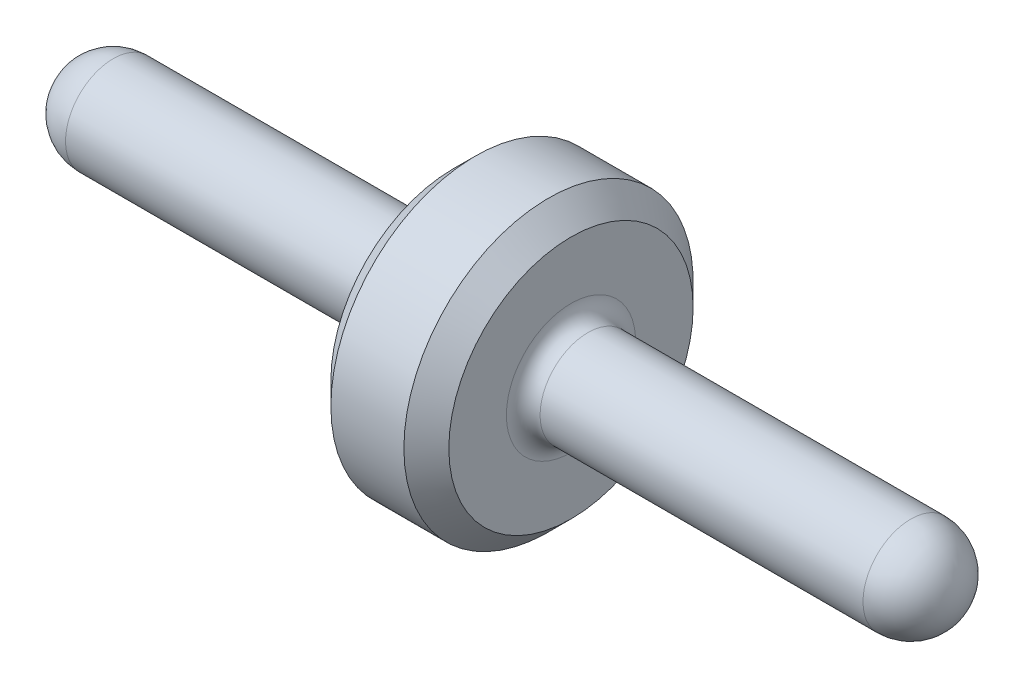
ISO-10303-21;
HEADER;
FILE_DESCRIPTION(('STEP AP214'),'2;1');
FILE_NAME('part.step','',(''),(''),'','','');
FILE_SCHEMA(('AUTOMOTIVE_DESIGN { 1 0 10303 214 1 1 1 1 }'));
ENDSEC;
DATA;
#1=APPLICATION_CONTEXT('core data for automotive mechanical design processes');
#2=APPLICATION_PROTOCOL_DEFINITION('international standard','automotive_design',2000,#1);
#3=PRODUCT_CONTEXT('',#1,'mechanical');
#4=PRODUCT('Part','Part','',(#3));
#5=PRODUCT_RELATED_PRODUCT_CATEGORY('part','',(#4));
#6=PRODUCT_DEFINITION_FORMATION('','',#4);
#7=PRODUCT_DEFINITION_CONTEXT('part definition',#1,'design');
#8=PRODUCT_DEFINITION('design','',#6,#7);
#9=PRODUCT_DEFINITION_SHAPE('','',#8);
#10=(LENGTH_UNIT() NAMED_UNIT(*) SI_UNIT(.MILLI.,.METRE.));
#11=(NAMED_UNIT(*) PLANE_ANGLE_UNIT() SI_UNIT($,.RADIAN.));
#12=(NAMED_UNIT(*) SI_UNIT($,.STERADIAN.) SOLID_ANGLE_UNIT());
#13=UNCERTAINTY_MEASURE_WITH_UNIT(LENGTH_MEASURE(1.E-05),#10,'distance_accuracy_value','');
#14=(GEOMETRIC_REPRESENTATION_CONTEXT(3) GLOBAL_UNCERTAINTY_ASSIGNED_CONTEXT((#13)) GLOBAL_UNIT_ASSIGNED_CONTEXT((#10,
#11,#12)) REPRESENTATION_CONTEXT('',''));
#15=CARTESIAN_POINT('',(0.,0.,0.));
#16=DIRECTION('',(0.,0.,1.));
#17=DIRECTION('',(1.,0.,0.));
#18=AXIS2_PLACEMENT_3D('',#15,#16,#17);
#19=CARTESIAN_POINT('',(1.67640000000001,0.,0.));
#20=DIRECTION('',(-1.,0.,0.));
#21=DIRECTION('',(0.,0.,1.));
#22=AXIS2_PLACEMENT_3D('',#19,#20,#21);
#23=TOROIDAL_SURFACE('',#22,0.29209999999999,0.0761999999999985);
#24=CARTESIAN_POINT('',(1.67640000000001,0.,0.));
#25=DIRECTION('',(-1.,0.,0.));
#26=DIRECTION('',(0.,0.,1.));
#27=AXIS2_PLACEMENT_3D('',#24,#25,#26);
#28=CIRCLE('',#27,0.215899999999991);
#29=CARTESIAN_POINT('',(1.67640000000001,0.,0.215899999999991));
#30=VERTEX_POINT('',#29);
#31=EDGE_CURVE('E10',#30,#30,#28,.T.);
#32=ORIENTED_EDGE('',*,*,#31,.F.);
#33=EDGE_LOOP('',(#32));
#34=FACE_BOUND('',#33,.T.);
#35=CARTESIAN_POINT('',(1.75260000000001,0.,0.));
#36=DIRECTION('',(-1.,0.,0.));
#37=DIRECTION('',(0.,0.,1.));
#38=AXIS2_PLACEMENT_3D('',#35,#36,#37);
#39=CIRCLE('',#38,0.29209999999999);
#40=CARTESIAN_POINT('',(1.75260000000001,0.,0.29209999999999));
#41=VERTEX_POINT('',#40);
#42=EDGE_CURVE('E65',#41,#41,#39,.T.);
#43=ORIENTED_EDGE('',*,*,#42,.T.);
#44=EDGE_LOOP('',(#43));
#45=FACE_BOUND('',#44,.T.);
#46=ADVANCED_FACE('F31',(#34,#45),#23,.F.);
#47=CARTESIAN_POINT('',(0.,0.,0.));
#48=DIRECTION('',(-1.,0.,0.));
#49=DIRECTION('',(0.,0.,1.));
#50=AXIS2_PLACEMENT_3D('',#47,#48,#49);
#51=CYLINDRICAL_SURFACE('',#50,0.215899999999991);
#52=CARTESIAN_POINT('',(0.215900000000005,0.,0.));
#53=DIRECTION('',(-1.,0.,0.));
#54=DIRECTION('',(0.,0.,1.));
#55=AXIS2_PLACEMENT_3D('',#52,#53,#54);
#56=CIRCLE('',#55,0.215899999999991);
#57=CARTESIAN_POINT('',(0.215900000000005,0.,0.215899999999991));
#58=VERTEX_POINT('',#57);
#59=EDGE_CURVE('E37',#58,#58,#56,.T.);
#60=ORIENTED_EDGE('',*,*,#59,.F.);
#61=EDGE_LOOP('',(#60));
#62=FACE_BOUND('',#61,.T.);
#63=ORIENTED_EDGE('',*,*,#31,.T.);
#64=EDGE_LOOP('',(#63));
#65=FACE_BOUND('',#64,.T.);
#66=ADVANCED_FACE('F119',(#62,#65),#51,.T.);
#67=CARTESIAN_POINT('',(0.215900000000005,0.,0.));
#68=DIRECTION('',(-1.,0.,0.));
#69=DIRECTION('',(0.,1.,0.));
#70=AXIS2_PLACEMENT_3D('',#67,#68,#69);
#71=SPHERICAL_SURFACE('',#70,0.215899999999998);
#72=ORIENTED_EDGE('',*,*,#59,.T.);
#73=EDGE_LOOP('',(#72));
#74=FACE_BOUND('',#73,.T.);
#75=ADVANCED_FACE('F114',(#74),#71,.T.);
#76=CARTESIAN_POINT('',(3.82270000000004,0.,0.));
#77=DIRECTION('',(-1.,0.,0.));
#78=DIRECTION('',(0.,1.,0.));
#79=AXIS2_PLACEMENT_3D('',#76,#77,#78);
#80=SPHERICAL_SURFACE('',#79,0.215899999999991);
#81=CARTESIAN_POINT('',(3.82270000000004,0.,0.));
#82=DIRECTION('',(-1.,0.,0.));
#83=DIRECTION('',(0.,0.,1.));
#84=AXIS2_PLACEMENT_3D('',#81,#82,#83);
#85=CIRCLE('',#84,0.215899999999991);
#86=CARTESIAN_POINT('',(3.82270000000004,0.,0.215899999999991));
#87=VERTEX_POINT('',#86);
#88=EDGE_CURVE('E41',#87,#87,#85,.T.);
#89=ORIENTED_EDGE('',*,*,#88,.F.);
#90=EDGE_LOOP('',(#89));
#91=FACE_BOUND('',#90,.T.);
#92=ADVANCED_FACE('F109',(#91),#80,.T.);
#93=CARTESIAN_POINT('',(0.,0.,0.));
#94=DIRECTION('',(-1.,0.,0.));
#95=DIRECTION('',(0.,0.,1.));
#96=AXIS2_PLACEMENT_3D('',#93,#94,#95);
#97=CYLINDRICAL_SURFACE('',#96,0.215899999999991);
#98=CARTESIAN_POINT('',(2.36220000000004,0.,0.));
#99=DIRECTION('',(-1.,0.,0.));
#100=DIRECTION('',(0.,0.,1.));
#101=AXIS2_PLACEMENT_3D('',#98,#99,#100);
#102=CIRCLE('',#101,0.215899999999991);
#103=CARTESIAN_POINT('',(2.36220000000004,0.,0.215899999999991));
#104=VERTEX_POINT('',#103);
#105=EDGE_CURVE('E45',#104,#104,#102,.T.);
#106=ORIENTED_EDGE('',*,*,#105,.F.);
#107=EDGE_LOOP('',(#106));
#108=FACE_BOUND('',#107,.T.);
#109=ORIENTED_EDGE('',*,*,#88,.T.);
#110=EDGE_LOOP('',(#109));
#111=FACE_BOUND('',#110,.T.);
#112=ADVANCED_FACE('F103',(#108,#111),#97,.T.);
#113=CARTESIAN_POINT('',(2.36220000000004,0.,0.));
#114=DIRECTION('',(-1.,0.,0.));
#115=DIRECTION('',(0.,0.,1.));
#116=AXIS2_PLACEMENT_3D('',#113,#114,#115);
#117=TOROIDAL_SURFACE('',#116,0.29209999999999,0.0761999999999985);
#118=CARTESIAN_POINT('',(2.28600000000004,0.,0.));
#119=DIRECTION('',(-1.,0.,0.));
#120=DIRECTION('',(0.,0.,1.));
#121=AXIS2_PLACEMENT_3D('',#118,#119,#120);
#122=CIRCLE('',#121,0.29209999999999);
#123=CARTESIAN_POINT('',(2.28600000000004,0.,0.29209999999999));
#124=VERTEX_POINT('',#123);
#125=EDGE_CURVE('E50',#124,#124,#122,.T.);
#126=ORIENTED_EDGE('',*,*,#125,.F.);
#127=EDGE_LOOP('',(#126));
#128=FACE_BOUND('',#127,.T.);
#129=ORIENTED_EDGE('',*,*,#105,.T.);
#130=EDGE_LOOP('',(#129));
#131=FACE_BOUND('',#130,.T.);
#132=ADVANCED_FACE('F97',(#128,#131),#117,.F.);
#133=CARTESIAN_POINT('',(2.28600000000002,0.29209999999999,0.));
#134=DIRECTION('',(-1.,0.,0.));
#135=DIRECTION('',(0.,0.,1.));
#136=AXIS2_PLACEMENT_3D('',#133,#134,#135);
#137=PLANE('',#136);
#138=CARTESIAN_POINT('',(2.286,0.,0.));
#139=DIRECTION('',(-1.,0.,0.));
#140=DIRECTION('',(0.,0.,1.));
#141=AXIS2_PLACEMENT_3D('',#138,#139,#140);
#142=CIRCLE('',#141,0.55245000000001);
#143=CARTESIAN_POINT('',(2.286,0.,0.55245000000001));
#144=VERTEX_POINT('',#143);
#145=EDGE_CURVE('E53',#144,#144,#142,.T.);
#146=ORIENTED_EDGE('',*,*,#145,.F.);
#147=EDGE_LOOP('',(#146));
#148=FACE_BOUND('',#147,.T.);
#149=ORIENTED_EDGE('',*,*,#125,.T.);
#150=EDGE_LOOP('',(#149));
#151=FACE_BOUND('',#150,.T.);
#152=ADVANCED_FACE('F91',(#148,#151),#137,.F.);
#153=CARTESIAN_POINT('',(2.286,0.,0.));
#154=DIRECTION('',(-1.,0.,0.));
#155=DIRECTION('',(0.,0.,1.));
#156=AXIS2_PLACEMENT_3D('',#153,#154,#155);
#157=CONICAL_SURFACE('',#156,0.55245000000001,0.785398163397584);
#158=CARTESIAN_POINT('',(2.18440000000004,0.,0.));
#159=DIRECTION('',(-1.,0.,0.));
#160=DIRECTION('',(0.,0.,1.));
#161=AXIS2_PLACEMENT_3D('',#158,#159,#160);
#162=CIRCLE('',#161,0.654049999999989);
#163=CARTESIAN_POINT('',(2.18440000000004,0.,0.654049999999989));
#164=VERTEX_POINT('',#163);
#165=EDGE_CURVE('E56',#164,#164,#162,.T.);
#166=ORIENTED_EDGE('',*,*,#165,.F.);
#167=EDGE_LOOP('',(#166));
#168=FACE_BOUND('',#167,.T.);
#169=ORIENTED_EDGE('',*,*,#145,.T.);
#170=EDGE_LOOP('',(#169));
#171=FACE_BOUND('',#170,.T.);
#172=ADVANCED_FACE('F85',(#168,#171),#157,.T.);
#173=CARTESIAN_POINT('',(0.,0.,0.));
#174=DIRECTION('',(-1.,0.,0.));
#175=DIRECTION('',(0.,0.,1.));
#176=AXIS2_PLACEMENT_3D('',#173,#174,#175);
#177=CYLINDRICAL_SURFACE('',#176,0.654049999999989);
#178=CARTESIAN_POINT('',(1.85420000000001,0.,0.));
#179=DIRECTION('',(-1.,0.,0.));
#180=DIRECTION('',(0.,0.,1.));
#181=AXIS2_PLACEMENT_3D('',#178,#179,#180);
#182=CIRCLE('',#181,0.654049999999989);
#183=CARTESIAN_POINT('',(1.85420000000001,0.,0.654049999999989));
#184=VERTEX_POINT('',#183);
#185=EDGE_CURVE('E59',#184,#184,#182,.T.);
#186=ORIENTED_EDGE('',*,*,#185,.F.);
#187=EDGE_LOOP('',(#186));
#188=FACE_BOUND('',#187,.T.);
#189=ORIENTED_EDGE('',*,*,#165,.T.);
#190=EDGE_LOOP('',(#189));
#191=FACE_BOUND('',#190,.T.);
#192=ADVANCED_FACE('F79',(#188,#191),#177,.T.);
#193=CARTESIAN_POINT('',(1.85420000000001,0.,0.));
#194=DIRECTION('',(1.,0.,0.));
#195=DIRECTION('',(0.,0.,-1.));
#196=AXIS2_PLACEMENT_3D('',#193,#194,#195);
#197=CONICAL_SURFACE('',#196,0.654049999999989,0.785398163397448);
#198=CARTESIAN_POINT('',(1.75260000000001,0.,0.));
#199=DIRECTION('',(-1.,0.,0.));
#200=DIRECTION('',(0.,0.,1.));
#201=AXIS2_PLACEMENT_3D('',#198,#199,#200);
#202=CIRCLE('',#201,0.552449999999982);
#203=CARTESIAN_POINT('',(1.75260000000001,0.,0.552449999999982));
#204=VERTEX_POINT('',#203);
#205=EDGE_CURVE('E62',#204,#204,#202,.T.);
#206=ORIENTED_EDGE('',*,*,#205,.F.);
#207=EDGE_LOOP('',(#206));
#208=FACE_BOUND('',#207,.T.);
#209=ORIENTED_EDGE('',*,*,#185,.T.);
#210=EDGE_LOOP('',(#209));
#211=FACE_BOUND('',#210,.T.);
#212=ADVANCED_FACE('F73',(#208,#211),#197,.T.);
#213=CARTESIAN_POINT('',(1.75260000000001,0.29209999999999,0.));
#214=DIRECTION('',(1.,0.,0.));
#215=DIRECTION('',(0.,0.,-1.));
#216=AXIS2_PLACEMENT_3D('',#213,#214,#215);
#217=PLANE('',#216);
#218=ORIENTED_EDGE('',*,*,#42,.F.);
#219=EDGE_LOOP('',(#218));
#220=FACE_BOUND('',#219,.T.);
#221=ORIENTED_EDGE('',*,*,#205,.T.);
#222=EDGE_LOOP('',(#221));
#223=FACE_BOUND('',#222,.T.);
#224=ADVANCED_FACE('F70',(#220,#223),#217,.F.);
#225=CLOSED_SHELL('',(#46,#66,#75,#92,#112,#132,#152,#172,#192,#212,#224));
#226=MANIFOLD_SOLID_BREP('B2',#225);
#227=ADVANCED_BREP_SHAPE_REPRESENTATION('',(#18,#226),#14);
#228=SHAPE_DEFINITION_REPRESENTATION(#9,#227);
ENDSEC;
END-ISO-10303-21;
